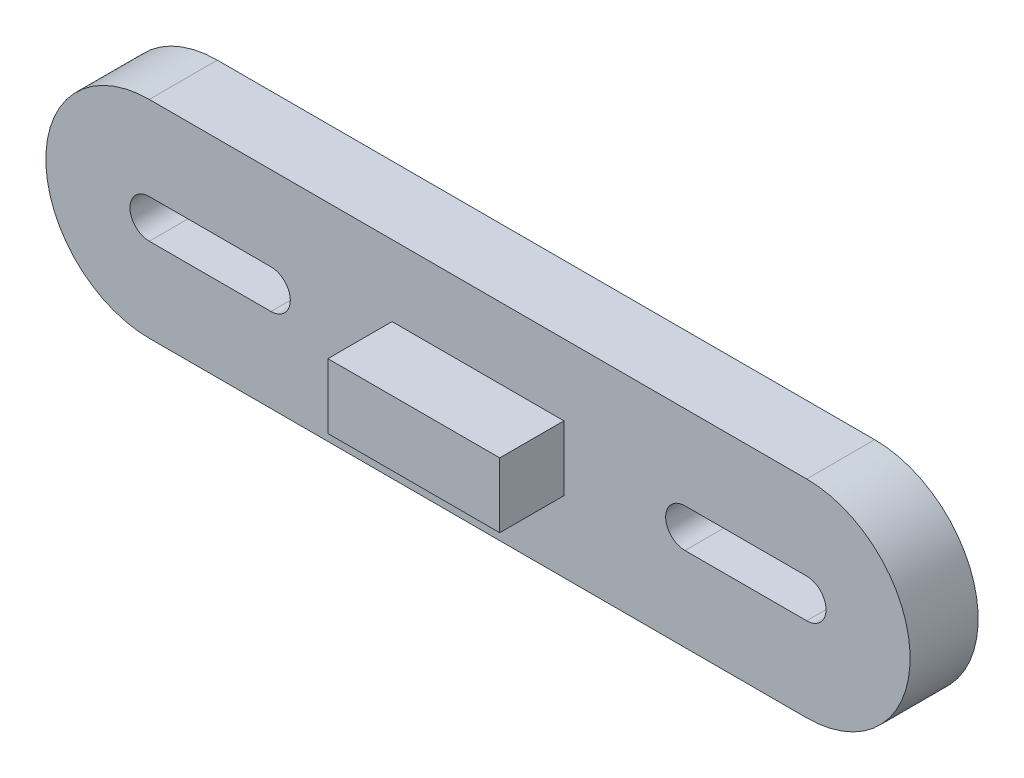
ISO-10303-21;
HEADER;
FILE_DESCRIPTION(('STEP AP214'),'2;1');
FILE_NAME('part.step','',(''),(''),'','','');
FILE_SCHEMA(('AUTOMOTIVE_DESIGN { 1 0 10303 214 1 1 1 1 }'));
ENDSEC;
DATA;
#1=APPLICATION_CONTEXT('core data for automotive mechanical design processes');
#2=APPLICATION_PROTOCOL_DEFINITION('international standard','automotive_design',2000,#1);
#3=PRODUCT_CONTEXT('',#1,'mechanical');
#4=PRODUCT('Part','Part','',(#3));
#5=PRODUCT_RELATED_PRODUCT_CATEGORY('part','',(#4));
#6=PRODUCT_DEFINITION_FORMATION('','',#4);
#7=PRODUCT_DEFINITION_CONTEXT('part definition',#1,'design');
#8=PRODUCT_DEFINITION('design','',#6,#7);
#9=PRODUCT_DEFINITION_SHAPE('','',#8);
#10=(LENGTH_UNIT() NAMED_UNIT(*) SI_UNIT(.MILLI.,.METRE.));
#11=(NAMED_UNIT(*) PLANE_ANGLE_UNIT() SI_UNIT($,.RADIAN.));
#12=(NAMED_UNIT(*) SI_UNIT($,.STERADIAN.) SOLID_ANGLE_UNIT());
#13=UNCERTAINTY_MEASURE_WITH_UNIT(LENGTH_MEASURE(1.E-05),#10,'distance_accuracy_value','');
#14=(GEOMETRIC_REPRESENTATION_CONTEXT(3) GLOBAL_UNCERTAINTY_ASSIGNED_CONTEXT((#13)) GLOBAL_UNIT_ASSIGNED_CONTEXT((#10,
#11,#12)) REPRESENTATION_CONTEXT('',''));
#15=CARTESIAN_POINT('',(0.,0.,0.));
#16=DIRECTION('',(0.,0.,1.));
#17=DIRECTION('',(1.,0.,0.));
#18=AXIS2_PLACEMENT_3D('',#15,#16,#17);
#19=CARTESIAN_POINT('',(-14.345,0.,2.97));
#20=DIRECTION('',(0.,0.,1.));
#21=DIRECTION('',(1.,0.,0.));
#22=AXIS2_PLACEMENT_3D('',#19,#20,#21);
#23=PLANE('',#22);
#24=CARTESIAN_POINT('',(-14.345,0.,2.97));
#25=DIRECTION('',(0.,0.,1.));
#26=DIRECTION('',(1.,0.,0.));
#27=AXIS2_PLACEMENT_3D('',#24,#25,#26);
#28=CIRCLE('',#27,4.51436853002071);
#29=CARTESIAN_POINT('',(-14.345,4.51436853002071,2.97));
#30=VERTEX_POINT('',#29);
#31=CARTESIAN_POINT('',(-14.345,-4.51436853002071,2.97));
#32=VERTEX_POINT('',#31);
#33=EDGE_CURVE('E271',#30,#32,#28,.T.);
#34=ORIENTED_EDGE('',*,*,#33,.T.);
#35=DIRECTION('',(1.,0.,0.));
#36=VECTOR('',#35,1.);
#37=CARTESIAN_POINT('',(-14.345,-4.51436853002071,2.97));
#38=LINE('',#37,#36);
#39=CARTESIAN_POINT('',(14.345,-4.5143685300207,2.97));
#40=VERTEX_POINT('',#39);
#41=EDGE_CURVE('E275',#32,#40,#38,.T.);
#42=ORIENTED_EDGE('',*,*,#41,.T.);
#43=CARTESIAN_POINT('',(14.345,0.,2.97));
#44=DIRECTION('',(0.,0.,1.));
#45=DIRECTION('',(1.,0.,0.));
#46=AXIS2_PLACEMENT_3D('',#43,#44,#45);
#47=CIRCLE('',#46,4.51436853002071);
#48=CARTESIAN_POINT('',(14.345,4.51436853002071,2.97));
#49=VERTEX_POINT('',#48);
#50=EDGE_CURVE('E279',#40,#49,#47,.T.);
#51=ORIENTED_EDGE('',*,*,#50,.T.);
#52=DIRECTION('',(-1.,0.,0.));
#53=VECTOR('',#52,1.);
#54=CARTESIAN_POINT('',(-14.345,4.51436853002071,2.97));
#55=LINE('',#54,#53);
#56=EDGE_CURVE('E282',#49,#30,#55,.T.);
#57=ORIENTED_EDGE('',*,*,#56,.T.);
#58=EDGE_LOOP('',(#34,#42,#51,#57));
#59=FACE_BOUND('',#58,.T.);
#60=DIRECTION('',(1.,0.,0.));
#61=VECTOR('',#60,1.);
#62=CARTESIAN_POINT('',(-14.345,-0.844368530020709,2.97));
#63=LINE('',#62,#61);
#64=CARTESIAN_POINT('',(-14.345,-0.844368530020709,2.97));
#65=VERTEX_POINT('',#64);
#66=CARTESIAN_POINT('',(-9.035,-0.844368530020709,2.97));
#67=VERTEX_POINT('',#66);
#68=EDGE_CURVE('E231',#65,#67,#63,.T.);
#69=ORIENTED_EDGE('',*,*,#68,.F.);
#70=CARTESIAN_POINT('',(-14.345,0.,2.97));
#71=DIRECTION('',(0.,0.,1.));
#72=DIRECTION('',(1.,0.,0.));
#73=AXIS2_PLACEMENT_3D('',#70,#71,#72);
#74=CIRCLE('',#73,0.844368530020709);
#75=CARTESIAN_POINT('',(-14.345,0.844368530020709,2.97));
#76=VERTEX_POINT('',#75);
#77=EDGE_CURVE('E228',#76,#65,#74,.T.);
#78=ORIENTED_EDGE('',*,*,#77,.F.);
#79=DIRECTION('',(-1.,0.,0.));
#80=VECTOR('',#79,1.);
#81=CARTESIAN_POINT('',(-14.345,0.844368530020709,2.97));
#82=LINE('',#81,#80);
#83=CARTESIAN_POINT('',(-9.035,0.844368530020709,2.97));
#84=VERTEX_POINT('',#83);
#85=EDGE_CURVE('E239',#84,#76,#82,.T.);
#86=ORIENTED_EDGE('',*,*,#85,.F.);
#87=CARTESIAN_POINT('',(-9.035,0.,2.97));
#88=DIRECTION('',(0.,0.,1.));
#89=DIRECTION('',(1.,0.,0.));
#90=AXIS2_PLACEMENT_3D('',#87,#88,#89);
#91=CIRCLE('',#90,0.844368530020709);
#92=EDGE_CURVE('E235',#67,#84,#91,.T.);
#93=ORIENTED_EDGE('',*,*,#92,.F.);
#94=EDGE_LOOP('',(#69,#78,#86,#93));
#95=FACE_BOUND('',#94,.T.);
#96=DIRECTION('',(-1.,0.,0.));
#97=VECTOR('',#96,1.);
#98=CARTESIAN_POINT('',(14.345,0.844368530020701,2.97));
#99=LINE('',#98,#97);
#100=CARTESIAN_POINT('',(14.345,0.844368530020701,2.97));
#101=VERTEX_POINT('',#100);
#102=CARTESIAN_POINT('',(9.035,0.844368530020701,2.97));
#103=VERTEX_POINT('',#102);
#104=EDGE_CURVE('E194',#101,#103,#99,.T.);
#105=ORIENTED_EDGE('',*,*,#104,.F.);
#106=CARTESIAN_POINT('',(14.345,0.,2.97));
#107=DIRECTION('',(0.,0.,1.));
#108=DIRECTION('',(1.,0.,0.));
#109=AXIS2_PLACEMENT_3D('',#106,#107,#108);
#110=CIRCLE('',#109,0.844368530020701);
#111=CARTESIAN_POINT('',(14.345,-0.844368530020701,2.97));
#112=VERTEX_POINT('',#111);
#113=EDGE_CURVE('E191',#112,#101,#110,.T.);
#114=ORIENTED_EDGE('',*,*,#113,.F.);
#115=DIRECTION('',(1.,0.,0.));
#116=VECTOR('',#115,1.);
#117=CARTESIAN_POINT('',(14.345,-0.844368530020701,2.97));
#118=LINE('',#117,#116);
#119=CARTESIAN_POINT('',(9.03500000000001,-0.844368530020701,2.97));
#120=VERTEX_POINT('',#119);
#121=EDGE_CURVE('E201',#120,#112,#118,.T.);
#122=ORIENTED_EDGE('',*,*,#121,.F.);
#123=CARTESIAN_POINT('',(9.035,0.,2.97));
#124=DIRECTION('',(0.,0.,1.));
#125=DIRECTION('',(1.,0.,0.));
#126=AXIS2_PLACEMENT_3D('',#123,#124,#125);
#127=CIRCLE('',#126,0.844368530020701);
#128=EDGE_CURVE('E198',#103,#120,#127,.T.);
#129=ORIENTED_EDGE('',*,*,#128,.F.);
#130=EDGE_LOOP('',(#105,#114,#122,#129));
#131=FACE_BOUND('',#130,.T.);
#132=DIRECTION('',(-1.,0.,0.));
#133=VECTOR('',#132,1.);
#134=CARTESIAN_POINT('',(-3.75,1.415,2.97));
#135=LINE('',#134,#133);
#136=CARTESIAN_POINT('',(3.75,1.415,2.97));
#137=VERTEX_POINT('',#136);
#138=CARTESIAN_POINT('',(-3.75,1.415,2.97));
#139=VERTEX_POINT('',#138);
#140=EDGE_CURVE('E373',#137,#139,#135,.T.);
#141=ORIENTED_EDGE('',*,*,#140,.F.);
#142=DIRECTION('',(0.,1.,0.));
#143=VECTOR('',#142,1.);
#144=CARTESIAN_POINT('',(3.75,1.415,2.97));
#145=LINE('',#144,#143);
#146=CARTESIAN_POINT('',(3.75,-1.415,2.97));
#147=VERTEX_POINT('',#146);
#148=EDGE_CURVE('E178',#147,#137,#145,.T.);
#149=ORIENTED_EDGE('',*,*,#148,.F.);
#150=DIRECTION('',(1.,0.,0.));
#151=VECTOR('',#150,1.);
#152=CARTESIAN_POINT('',(-3.75,-1.415,2.97));
#153=LINE('',#152,#151);
#154=CARTESIAN_POINT('',(-3.75,-1.415,2.97));
#155=VERTEX_POINT('',#154);
#156=EDGE_CURVE('E174',#155,#147,#153,.T.);
#157=ORIENTED_EDGE('',*,*,#156,.F.);
#158=DIRECTION('',(0.,-1.,0.));
#159=VECTOR('',#158,1.);
#160=CARTESIAN_POINT('',(-3.75,1.415,2.97));
#161=LINE('',#160,#159);
#162=EDGE_CURVE('E375',#139,#155,#161,.T.);
#163=ORIENTED_EDGE('',*,*,#162,.F.);
#164=EDGE_LOOP('',(#141,#149,#157,#163));
#165=FACE_BOUND('',#164,.T.);
#166=ADVANCED_FACE('F39',(#59,#95,#131,#165),#23,.T.);
#167=CARTESIAN_POINT('',(-14.345,0.,0.));
#168=DIRECTION('',(0.,0.,1.));
#169=DIRECTION('',(1.,0.,0.));
#170=AXIS2_PLACEMENT_3D('',#167,#168,#169);
#171=PLANE('',#170);
#172=CARTESIAN_POINT('',(-14.345,0.,0.));
#173=DIRECTION('',(0.,0.,1.));
#174=DIRECTION('',(1.,0.,0.));
#175=AXIS2_PLACEMENT_3D('',#172,#173,#174);
#176=CIRCLE('',#175,0.844368530020709);
#177=CARTESIAN_POINT('',(-14.345,0.844368530020709,0.));
#178=VERTEX_POINT('',#177);
#179=CARTESIAN_POINT('',(-14.345,-0.844368530020709,0.));
#180=VERTEX_POINT('',#179);
#181=EDGE_CURVE('E227',#178,#180,#176,.T.);
#182=ORIENTED_EDGE('',*,*,#181,.T.);
#183=DIRECTION('',(1.,0.,0.));
#184=VECTOR('',#183,1.);
#185=CARTESIAN_POINT('',(-14.345,-0.844368530020709,0.));
#186=LINE('',#185,#184);
#187=CARTESIAN_POINT('',(-9.035,-0.844368530020709,0.));
#188=VERTEX_POINT('',#187);
#189=EDGE_CURVE('E246',#180,#188,#186,.T.);
#190=ORIENTED_EDGE('',*,*,#189,.T.);
#191=CARTESIAN_POINT('',(-9.035,0.,0.));
#192=DIRECTION('',(0.,0.,1.));
#193=DIRECTION('',(1.,0.,0.));
#194=AXIS2_PLACEMENT_3D('',#191,#192,#193);
#195=CIRCLE('',#194,0.844368530020709);
#196=CARTESIAN_POINT('',(-9.035,0.844368530020709,0.));
#197=VERTEX_POINT('',#196);
#198=EDGE_CURVE('E250',#188,#197,#195,.T.);
#199=ORIENTED_EDGE('',*,*,#198,.T.);
#200=DIRECTION('',(-1.,0.,0.));
#201=VECTOR('',#200,1.);
#202=CARTESIAN_POINT('',(-14.345,0.844368530020709,0.));
#203=LINE('',#202,#201);
#204=EDGE_CURVE('E232',#197,#178,#203,.T.);
#205=ORIENTED_EDGE('',*,*,#204,.T.);
#206=EDGE_LOOP('',(#182,#190,#199,#205));
#207=FACE_BOUND('',#206,.T.);
#208=CARTESIAN_POINT('',(-14.345,0.,0.));
#209=DIRECTION('',(0.,0.,1.));
#210=DIRECTION('',(1.,0.,0.));
#211=AXIS2_PLACEMENT_3D('',#208,#209,#210);
#212=CIRCLE('',#211,4.51436853002071);
#213=CARTESIAN_POINT('',(-14.345,4.51436853002071,0.));
#214=VERTEX_POINT('',#213);
#215=CARTESIAN_POINT('',(-14.345,-4.51436853002071,0.));
#216=VERTEX_POINT('',#215);
#217=EDGE_CURVE('E270',#214,#216,#212,.T.);
#218=ORIENTED_EDGE('',*,*,#217,.F.);
#219=DIRECTION('',(-1.,0.,0.));
#220=VECTOR('',#219,1.);
#221=CARTESIAN_POINT('',(-14.345,4.51436853002071,0.));
#222=LINE('',#221,#220);
#223=CARTESIAN_POINT('',(14.345,4.51436853002071,0.));
#224=VERTEX_POINT('',#223);
#225=EDGE_CURVE('E276',#224,#214,#222,.T.);
#226=ORIENTED_EDGE('',*,*,#225,.F.);
#227=CARTESIAN_POINT('',(14.345,0.,0.));
#228=DIRECTION('',(0.,0.,1.));
#229=DIRECTION('',(1.,0.,0.));
#230=AXIS2_PLACEMENT_3D('',#227,#228,#229);
#231=CIRCLE('',#230,4.51436853002071);
#232=CARTESIAN_POINT('',(14.345,-4.5143685300207,0.));
#233=VERTEX_POINT('',#232);
#234=EDGE_CURVE('E292',#233,#224,#231,.T.);
#235=ORIENTED_EDGE('',*,*,#234,.F.);
#236=DIRECTION('',(1.,0.,0.));
#237=VECTOR('',#236,1.);
#238=CARTESIAN_POINT('',(-14.345,-4.51436853002071,0.));
#239=LINE('',#238,#237);
#240=EDGE_CURVE('E289',#216,#233,#239,.T.);
#241=ORIENTED_EDGE('',*,*,#240,.F.);
#242=EDGE_LOOP('',(#218,#226,#235,#241));
#243=FACE_BOUND('',#242,.T.);
#244=CARTESIAN_POINT('',(14.345,0.,0.));
#245=DIRECTION('',(0.,0.,1.));
#246=DIRECTION('',(1.,0.,0.));
#247=AXIS2_PLACEMENT_3D('',#244,#245,#246);
#248=CIRCLE('',#247,0.844368530020701);
#249=CARTESIAN_POINT('',(14.345,-0.844368530020701,0.));
#250=VERTEX_POINT('',#249);
#251=CARTESIAN_POINT('',(14.345,0.844368530020701,0.));
#252=VERTEX_POINT('',#251);
#253=EDGE_CURVE('E181',#250,#252,#248,.T.);
#254=ORIENTED_EDGE('',*,*,#253,.T.);
#255=DIRECTION('',(-1.,0.,0.));
#256=VECTOR('',#255,1.);
#257=CARTESIAN_POINT('',(14.345,0.844368530020701,0.));
#258=LINE('',#257,#256);
#259=CARTESIAN_POINT('',(9.035,0.844368530020701,0.));
#260=VERTEX_POINT('',#259);
#261=EDGE_CURVE('E186',#252,#260,#258,.T.);
#262=ORIENTED_EDGE('',*,*,#261,.T.);
#263=CARTESIAN_POINT('',(9.035,0.,0.));
#264=DIRECTION('',(0.,0.,1.));
#265=DIRECTION('',(1.,0.,0.));
#266=AXIS2_PLACEMENT_3D('',#263,#264,#265);
#267=CIRCLE('',#266,0.844368530020701);
#268=CARTESIAN_POINT('',(9.035,-0.844368530020701,0.));
#269=VERTEX_POINT('',#268);
#270=EDGE_CURVE('E208',#260,#269,#267,.T.);
#271=ORIENTED_EDGE('',*,*,#270,.T.);
#272=DIRECTION('',(1.,0.,0.));
#273=VECTOR('',#272,1.);
#274=CARTESIAN_POINT('',(14.345,-0.844368530020701,0.));
#275=LINE('',#274,#273);
#276=EDGE_CURVE('E195',#269,#250,#275,.T.);
#277=ORIENTED_EDGE('',*,*,#276,.T.);
#278=EDGE_LOOP('',(#254,#262,#271,#277));
#279=FACE_BOUND('',#278,.T.);
#280=ADVANCED_FACE('F315',(#207,#243,#279),#171,.F.);
#281=CARTESIAN_POINT('',(-14.345,0.,2.97));
#282=DIRECTION('',(0.,0.,-1.));
#283=DIRECTION('',(-1.,0.,0.));
#284=AXIS2_PLACEMENT_3D('',#281,#282,#283);
#285=CYLINDRICAL_SURFACE('',#284,4.51436853002071);
#286=ORIENTED_EDGE('',*,*,#217,.T.);
#287=DIRECTION('',(0.,0.,-1.));
#288=VECTOR('',#287,1.);
#289=CARTESIAN_POINT('',(-14.345,-4.51436853002071,2.97));
#290=LINE('',#289,#288);
#291=EDGE_CURVE('E11',#32,#216,#290,.T.);
#292=ORIENTED_EDGE('',*,*,#291,.F.);
#293=ORIENTED_EDGE('',*,*,#33,.F.);
#294=DIRECTION('',(0.,0.,-1.));
#295=VECTOR('',#294,1.);
#296=CARTESIAN_POINT('',(-14.345,4.51436853002071,2.97));
#297=LINE('',#296,#295);
#298=EDGE_CURVE('E285',#30,#214,#297,.T.);
#299=ORIENTED_EDGE('',*,*,#298,.T.);
#300=EDGE_LOOP('',(#286,#292,#293,#299));
#301=FACE_BOUND('',#300,.T.);
#302=ADVANCED_FACE('F41',(#301),#285,.T.);
#303=CARTESIAN_POINT('',(-14.345,-4.51436853002071,2.97));
#304=DIRECTION('',(0.,1.,0.));
#305=DIRECTION('',(-1.,0.,0.));
#306=AXIS2_PLACEMENT_3D('',#303,#304,#305);
#307=PLANE('',#306);
#308=ORIENTED_EDGE('',*,*,#240,.T.);
#309=DIRECTION('',(0.,0.,-1.));
#310=VECTOR('',#309,1.);
#311=CARTESIAN_POINT('',(14.345,-4.5143685300207,2.97));
#312=LINE('',#311,#310);
#313=EDGE_CURVE('E48',#40,#233,#312,.T.);
#314=ORIENTED_EDGE('',*,*,#313,.F.);
#315=ORIENTED_EDGE('',*,*,#41,.F.);
#316=ORIENTED_EDGE('',*,*,#291,.T.);
#317=EDGE_LOOP('',(#308,#314,#315,#316));
#318=FACE_BOUND('',#317,.T.);
#319=ADVANCED_FACE('F326',(#318),#307,.F.);
#320=CARTESIAN_POINT('',(14.345,0.,2.97));
#321=DIRECTION('',(0.,0.,-1.));
#322=DIRECTION('',(-1.,0.,0.));
#323=AXIS2_PLACEMENT_3D('',#320,#321,#322);
#324=CYLINDRICAL_SURFACE('',#323,4.51436853002071);
#325=ORIENTED_EDGE('',*,*,#234,.T.);
#326=DIRECTION('',(0.,0.,-1.));
#327=VECTOR('',#326,1.);
#328=CARTESIAN_POINT('',(14.345,4.51436853002071,2.97));
#329=LINE('',#328,#327);
#330=EDGE_CURVE('E300',#49,#224,#329,.T.);
#331=ORIENTED_EDGE('',*,*,#330,.F.);
#332=ORIENTED_EDGE('',*,*,#50,.F.);
#333=ORIENTED_EDGE('',*,*,#313,.T.);
#334=EDGE_LOOP('',(#325,#331,#332,#333));
#335=FACE_BOUND('',#334,.T.);
#336=ADVANCED_FACE('F309',(#335),#324,.T.);
#337=CARTESIAN_POINT('',(-14.345,4.51436853002071,2.97));
#338=DIRECTION('',(0.,-1.,0.));
#339=DIRECTION('',(1.,0.,0.));
#340=AXIS2_PLACEMENT_3D('',#337,#338,#339);
#341=PLANE('',#340);
#342=ORIENTED_EDGE('',*,*,#225,.T.);
#343=ORIENTED_EDGE('',*,*,#298,.F.);
#344=ORIENTED_EDGE('',*,*,#56,.F.);
#345=ORIENTED_EDGE('',*,*,#330,.T.);
#346=EDGE_LOOP('',(#342,#343,#344,#345));
#347=FACE_BOUND('',#346,.T.);
#348=ADVANCED_FACE('F319',(#347),#341,.F.);
#349=CARTESIAN_POINT('',(-14.345,0.,2.97));
#350=DIRECTION('',(0.,0.,-1.));
#351=DIRECTION('',(-1.,0.,0.));
#352=AXIS2_PLACEMENT_3D('',#349,#350,#351);
#353=CYLINDRICAL_SURFACE('',#352,0.844368530020709);
#354=ORIENTED_EDGE('',*,*,#181,.F.);
#355=DIRECTION('',(0.,0.,-1.));
#356=VECTOR('',#355,1.);
#357=CARTESIAN_POINT('',(-14.345,0.844368530020709,2.97));
#358=LINE('',#357,#356);
#359=EDGE_CURVE('E242',#76,#178,#358,.T.);
#360=ORIENTED_EDGE('',*,*,#359,.F.);
#361=ORIENTED_EDGE('',*,*,#77,.T.);
#362=DIRECTION('',(0.,0.,-1.));
#363=VECTOR('',#362,1.);
#364=CARTESIAN_POINT('',(-14.345,-0.844368530020709,2.97));
#365=LINE('',#364,#363);
#366=EDGE_CURVE('E266',#65,#180,#365,.T.);
#367=ORIENTED_EDGE('',*,*,#366,.T.);
#368=EDGE_LOOP('',(#354,#360,#361,#367));
#369=FACE_BOUND('',#368,.T.);
#370=ADVANCED_FACE('F341',(#369),#353,.F.);
#371=CARTESIAN_POINT('',(-14.345,-0.844368530020709,2.97));
#372=DIRECTION('',(0.,1.,0.));
#373=DIRECTION('',(0.,0.,1.));
#374=AXIS2_PLACEMENT_3D('',#371,#372,#373);
#375=PLANE('',#374);
#376=ORIENTED_EDGE('',*,*,#189,.F.);
#377=ORIENTED_EDGE('',*,*,#366,.F.);
#378=ORIENTED_EDGE('',*,*,#68,.T.);
#379=DIRECTION('',(0.,0.,-1.));
#380=VECTOR('',#379,1.);
#381=CARTESIAN_POINT('',(-9.035,-0.844368530020709,2.97));
#382=LINE('',#381,#380);
#383=EDGE_CURVE('E263',#67,#188,#382,.T.);
#384=ORIENTED_EDGE('',*,*,#383,.T.);
#385=EDGE_LOOP('',(#376,#377,#378,#384));
#386=FACE_BOUND('',#385,.T.);
#387=ADVANCED_FACE('F348',(#386),#375,.T.);
#388=CARTESIAN_POINT('',(-9.035,0.,2.97));
#389=DIRECTION('',(0.,0.,-1.));
#390=DIRECTION('',(-1.,0.,0.));
#391=AXIS2_PLACEMENT_3D('',#388,#389,#390);
#392=CYLINDRICAL_SURFACE('',#391,0.844368530020709);
#393=ORIENTED_EDGE('',*,*,#198,.F.);
#394=ORIENTED_EDGE('',*,*,#383,.F.);
#395=ORIENTED_EDGE('',*,*,#92,.T.);
#396=DIRECTION('',(0.,0.,-1.));
#397=VECTOR('',#396,1.);
#398=CARTESIAN_POINT('',(-9.035,0.844368530020709,2.97));
#399=LINE('',#398,#397);
#400=EDGE_CURVE('E260',#84,#197,#399,.T.);
#401=ORIENTED_EDGE('',*,*,#400,.T.);
#402=EDGE_LOOP('',(#393,#394,#395,#401));
#403=FACE_BOUND('',#402,.T.);
#404=ADVANCED_FACE('F353',(#403),#392,.F.);
#405=CARTESIAN_POINT('',(-14.345,0.844368530020709,2.97));
#406=DIRECTION('',(0.,-1.,0.));
#407=DIRECTION('',(0.,0.,-1.));
#408=AXIS2_PLACEMENT_3D('',#405,#406,#407);
#409=PLANE('',#408);
#410=ORIENTED_EDGE('',*,*,#204,.F.);
#411=ORIENTED_EDGE('',*,*,#400,.F.);
#412=ORIENTED_EDGE('',*,*,#85,.T.);
#413=ORIENTED_EDGE('',*,*,#359,.T.);
#414=EDGE_LOOP('',(#410,#411,#412,#413));
#415=FACE_BOUND('',#414,.T.);
#416=ADVANCED_FACE('F360',(#415),#409,.T.);
#417=CARTESIAN_POINT('',(14.345,0.,2.97));
#418=DIRECTION('',(0.,0.,-1.));
#419=DIRECTION('',(-1.,0.,0.));
#420=AXIS2_PLACEMENT_3D('',#417,#418,#419);
#421=CYLINDRICAL_SURFACE('',#420,0.844368530020701);
#422=ORIENTED_EDGE('',*,*,#253,.F.);
#423=DIRECTION('',(0.,0.,-1.));
#424=VECTOR('',#423,1.);
#425=CARTESIAN_POINT('',(14.345,-0.844368530020701,2.97));
#426=LINE('',#425,#424);
#427=EDGE_CURVE('E203',#112,#250,#426,.T.);
#428=ORIENTED_EDGE('',*,*,#427,.F.);
#429=ORIENTED_EDGE('',*,*,#113,.T.);
#430=DIRECTION('',(0.,0.,-1.));
#431=VECTOR('',#430,1.);
#432=CARTESIAN_POINT('',(14.345,0.844368530020701,2.97));
#433=LINE('',#432,#431);
#434=EDGE_CURVE('E223',#101,#252,#433,.T.);
#435=ORIENTED_EDGE('',*,*,#434,.T.);
#436=EDGE_LOOP('',(#422,#428,#429,#435));
#437=FACE_BOUND('',#436,.T.);
#438=ADVANCED_FACE('F418',(#437),#421,.F.);
#439=CARTESIAN_POINT('',(14.345,0.844368530020701,2.97));
#440=DIRECTION('',(0.,-1.,0.));
#441=DIRECTION('',(1.,0.,0.));
#442=AXIS2_PLACEMENT_3D('',#439,#440,#441);
#443=PLANE('',#442);
#444=ORIENTED_EDGE('',*,*,#261,.F.);
#445=ORIENTED_EDGE('',*,*,#434,.F.);
#446=ORIENTED_EDGE('',*,*,#104,.T.);
#447=DIRECTION('',(0.,0.,-1.));
#448=VECTOR('',#447,1.);
#449=CARTESIAN_POINT('',(9.035,0.844368530020701,2.97));
#450=LINE('',#449,#448);
#451=EDGE_CURVE('E220',#103,#260,#450,.T.);
#452=ORIENTED_EDGE('',*,*,#451,.T.);
#453=EDGE_LOOP('',(#444,#445,#446,#452));
#454=FACE_BOUND('',#453,.T.);
#455=ADVANCED_FACE('F414',(#454),#443,.T.);
#456=CARTESIAN_POINT('',(9.035,0.,2.97));
#457=DIRECTION('',(0.,0.,-1.));
#458=DIRECTION('',(-1.,0.,0.));
#459=AXIS2_PLACEMENT_3D('',#456,#457,#458);
#460=CYLINDRICAL_SURFACE('',#459,0.844368530020701);
#461=ORIENTED_EDGE('',*,*,#270,.F.);
#462=ORIENTED_EDGE('',*,*,#451,.F.);
#463=ORIENTED_EDGE('',*,*,#128,.T.);
#464=DIRECTION('',(0.,0.,-1.));
#465=VECTOR('',#464,1.);
#466=CARTESIAN_POINT('',(9.035,-0.844368530020701,2.97));
#467=LINE('',#466,#465);
#468=EDGE_CURVE('E63',#120,#269,#467,.T.);
#469=ORIENTED_EDGE('',*,*,#468,.T.);
#470=EDGE_LOOP('',(#461,#462,#463,#469));
#471=FACE_BOUND('',#470,.T.);
#472=ADVANCED_FACE('F411',(#471),#460,.F.);
#473=CARTESIAN_POINT('',(14.345,-0.844368530020701,2.97));
#474=DIRECTION('',(0.,1.,0.));
#475=DIRECTION('',(-1.,0.,0.));
#476=AXIS2_PLACEMENT_3D('',#473,#474,#475);
#477=PLANE('',#476);
#478=ORIENTED_EDGE('',*,*,#276,.F.);
#479=ORIENTED_EDGE('',*,*,#468,.F.);
#480=ORIENTED_EDGE('',*,*,#121,.T.);
#481=ORIENTED_EDGE('',*,*,#427,.T.);
#482=EDGE_LOOP('',(#478,#479,#480,#481));
#483=FACE_BOUND('',#482,.T.);
#484=ADVANCED_FACE('F408',(#483),#477,.T.);
#485=CARTESIAN_POINT('',(3.75,1.415,5.77));
#486=DIRECTION('',(-1.,0.,0.));
#487=DIRECTION('',(0.,0.,1.));
#488=AXIS2_PLACEMENT_3D('',#485,#486,#487);
#489=PLANE('',#488);
#490=ORIENTED_EDGE('',*,*,#148,.T.);
#491=DIRECTION('',(0.,0.,-1.));
#492=VECTOR('',#491,1.);
#493=CARTESIAN_POINT('',(3.75,1.415,5.77));
#494=LINE('',#493,#492);
#495=CARTESIAN_POINT('',(3.75,1.415,5.77));
#496=VERTEX_POINT('',#495);
#497=EDGE_CURVE('E157',#496,#137,#494,.T.);
#498=ORIENTED_EDGE('',*,*,#497,.F.);
#499=DIRECTION('',(0.,1.,0.));
#500=VECTOR('',#499,1.);
#501=CARTESIAN_POINT('',(3.75,1.415,5.77));
#502=LINE('',#501,#500);
#503=CARTESIAN_POINT('',(3.75,-1.415,5.77));
#504=VERTEX_POINT('',#503);
#505=EDGE_CURVE('E165',#504,#496,#502,.T.);
#506=ORIENTED_EDGE('',*,*,#505,.F.);
#507=DIRECTION('',(0.,0.,-1.));
#508=VECTOR('',#507,1.);
#509=CARTESIAN_POINT('',(3.75,-1.415,5.77));
#510=LINE('',#509,#508);
#511=EDGE_CURVE('E386',#504,#147,#510,.T.);
#512=ORIENTED_EDGE('',*,*,#511,.T.);
#513=EDGE_LOOP('',(#490,#498,#506,#512));
#514=FACE_BOUND('',#513,.T.);
#515=ADVANCED_FACE('F176',(#514),#489,.F.);
#516=CARTESIAN_POINT('',(-3.75,1.415,5.77));
#517=DIRECTION('',(0.,-1.,0.));
#518=DIRECTION('',(0.,0.,-1.));
#519=AXIS2_PLACEMENT_3D('',#516,#517,#518);
#520=PLANE('',#519);
#521=ORIENTED_EDGE('',*,*,#140,.T.);
#522=DIRECTION('',(0.,0.,-1.));
#523=VECTOR('',#522,1.);
#524=CARTESIAN_POINT('',(-3.75,1.415,5.77));
#525=LINE('',#524,#523);
#526=CARTESIAN_POINT('',(-3.75,1.415,5.77));
#527=VERTEX_POINT('',#526);
#528=EDGE_CURVE('E160',#527,#139,#525,.T.);
#529=ORIENTED_EDGE('',*,*,#528,.F.);
#530=DIRECTION('',(-1.,0.,0.));
#531=VECTOR('',#530,1.);
#532=CARTESIAN_POINT('',(-3.75,1.415,5.77));
#533=LINE('',#532,#531);
#534=EDGE_CURVE('E153',#496,#527,#533,.T.);
#535=ORIENTED_EDGE('',*,*,#534,.F.);
#536=ORIENTED_EDGE('',*,*,#497,.T.);
#537=EDGE_LOOP('',(#521,#529,#535,#536));
#538=FACE_BOUND('',#537,.T.);
#539=ADVANCED_FACE('F155',(#538),#520,.F.);
#540=CARTESIAN_POINT('',(-3.75,1.415,5.77));
#541=DIRECTION('',(1.,0.,0.));
#542=DIRECTION('',(0.,0.,-1.));
#543=AXIS2_PLACEMENT_3D('',#540,#541,#542);
#544=PLANE('',#543);
#545=ORIENTED_EDGE('',*,*,#162,.T.);
#546=DIRECTION('',(0.,0.,-1.));
#547=VECTOR('',#546,1.);
#548=CARTESIAN_POINT('',(-3.75,-1.415,5.77));
#549=LINE('',#548,#547);
#550=CARTESIAN_POINT('',(-3.75,-1.415,5.77));
#551=VERTEX_POINT('',#550);
#552=EDGE_CURVE('E55',#551,#155,#549,.T.);
#553=ORIENTED_EDGE('',*,*,#552,.F.);
#554=DIRECTION('',(0.,-1.,0.));
#555=VECTOR('',#554,1.);
#556=CARTESIAN_POINT('',(-3.75,1.415,5.77));
#557=LINE('',#556,#555);
#558=EDGE_CURVE('E164',#527,#551,#557,.T.);
#559=ORIENTED_EDGE('',*,*,#558,.F.);
#560=ORIENTED_EDGE('',*,*,#528,.T.);
#561=EDGE_LOOP('',(#545,#553,#559,#560));
#562=FACE_BOUND('',#561,.T.);
#563=ADVANCED_FACE('F393',(#562),#544,.F.);
#564=CARTESIAN_POINT('',(-3.75,-1.415,5.77));
#565=DIRECTION('',(0.,1.,0.));
#566=DIRECTION('',(0.,0.,1.));
#567=AXIS2_PLACEMENT_3D('',#564,#565,#566);
#568=PLANE('',#567);
#569=ORIENTED_EDGE('',*,*,#156,.T.);
#570=ORIENTED_EDGE('',*,*,#511,.F.);
#571=DIRECTION('',(1.,0.,0.));
#572=VECTOR('',#571,1.);
#573=CARTESIAN_POINT('',(-3.75,-1.415,5.77));
#574=LINE('',#573,#572);
#575=EDGE_CURVE('E169',#551,#504,#574,.T.);
#576=ORIENTED_EDGE('',*,*,#575,.F.);
#577=ORIENTED_EDGE('',*,*,#552,.T.);
#578=EDGE_LOOP('',(#569,#570,#576,#577));
#579=FACE_BOUND('',#578,.T.);
#580=ADVANCED_FACE('F394',(#579),#568,.F.);
#581=CARTESIAN_POINT('',(0.,0.,5.77));
#582=DIRECTION('',(0.,0.,1.));
#583=DIRECTION('',(1.,0.,0.));
#584=AXIS2_PLACEMENT_3D('',#581,#582,#583);
#585=PLANE('',#584);
#586=ORIENTED_EDGE('',*,*,#505,.T.);
#587=ORIENTED_EDGE('',*,*,#534,.T.);
#588=ORIENTED_EDGE('',*,*,#558,.T.);
#589=ORIENTED_EDGE('',*,*,#575,.T.);
#590=EDGE_LOOP('',(#586,#587,#588,#589));
#591=FACE_BOUND('',#590,.T.);
#592=ADVANCED_FACE('F168',(#591),#585,.T.);
#593=CLOSED_SHELL('',(#166,#280,#302,#319,#336,#348,#370,#387,#404,#416,#438,#455,#472,#484,
#515,#539,#563,#580,#592));
#594=MANIFOLD_SOLID_BREP('B2',#593);
#595=ADVANCED_BREP_SHAPE_REPRESENTATION('',(#18,#594),#14);
#596=SHAPE_DEFINITION_REPRESENTATION(#9,#595);
ENDSEC;
END-ISO-10303-21;
